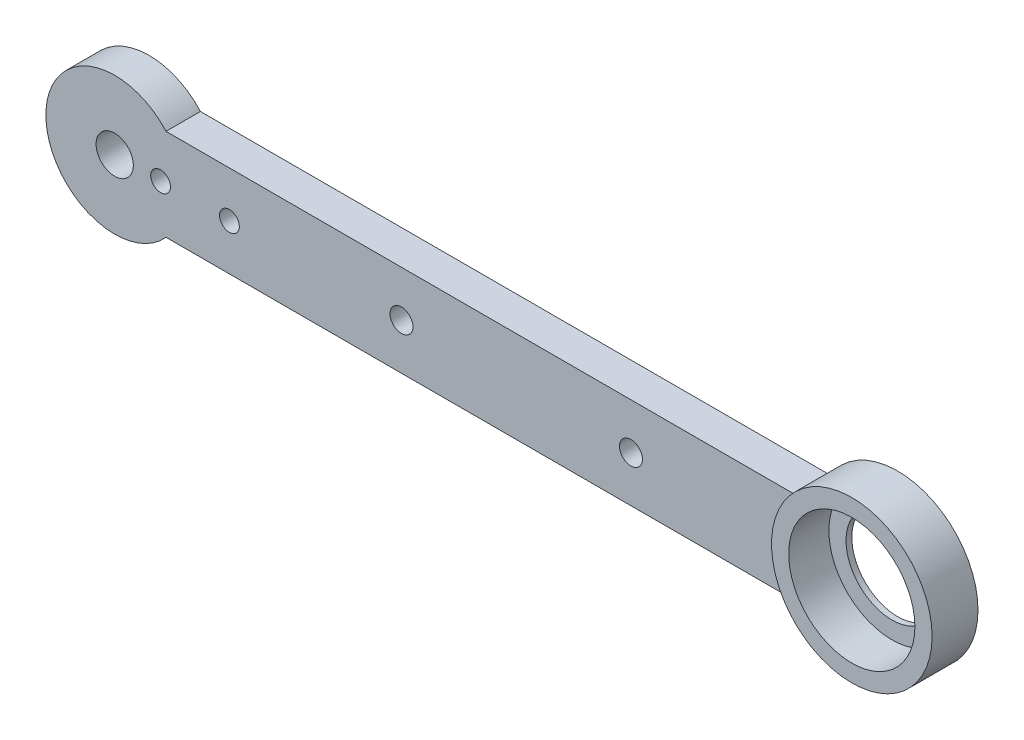
ISO-10303-21;
HEADER;
FILE_DESCRIPTION(('STEP AP214'),'2;1');
FILE_NAME('part.step','',(''),(''),'','','');
FILE_SCHEMA(('AUTOMOTIVE_DESIGN { 1 0 10303 214 1 1 1 1 }'));
ENDSEC;
DATA;
#1=APPLICATION_CONTEXT('core data for automotive mechanical design processes');
#2=APPLICATION_PROTOCOL_DEFINITION('international standard','automotive_design',2000,#1);
#3=PRODUCT_CONTEXT('',#1,'mechanical');
#4=PRODUCT('Part','Part','',(#3));
#5=PRODUCT_RELATED_PRODUCT_CATEGORY('part','',(#4));
#6=PRODUCT_DEFINITION_FORMATION('','',#4);
#7=PRODUCT_DEFINITION_CONTEXT('part definition',#1,'design');
#8=PRODUCT_DEFINITION('design','',#6,#7);
#9=PRODUCT_DEFINITION_SHAPE('','',#8);
#10=(LENGTH_UNIT() NAMED_UNIT(*) SI_UNIT(.MILLI.,.METRE.));
#11=(NAMED_UNIT(*) PLANE_ANGLE_UNIT() SI_UNIT($,.RADIAN.));
#12=(NAMED_UNIT(*) SI_UNIT($,.STERADIAN.) SOLID_ANGLE_UNIT());
#13=UNCERTAINTY_MEASURE_WITH_UNIT(LENGTH_MEASURE(1.E-05),#10,'distance_accuracy_value','');
#14=(GEOMETRIC_REPRESENTATION_CONTEXT(3) GLOBAL_UNCERTAINTY_ASSIGNED_CONTEXT((#13)) GLOBAL_UNIT_ASSIGNED_CONTEXT((#10,
#11,#12)) REPRESENTATION_CONTEXT('',''));
#15=CARTESIAN_POINT('',(0.,0.,0.));
#16=DIRECTION('',(0.,0.,1.));
#17=DIRECTION('',(1.,0.,0.));
#18=AXIS2_PLACEMENT_3D('',#15,#16,#17);
#19=CARTESIAN_POINT('',(0.,0.,9.));
#20=DIRECTION('',(0.,0.,1.));
#21=DIRECTION('',(1.,0.,0.));
#22=AXIS2_PLACEMENT_3D('',#19,#20,#21);
#23=PLANE('',#22);
#24=CARTESIAN_POINT('',(50.,0.,9.));
#25=DIRECTION('',(0.,0.,1.));
#26=DIRECTION('',(1.,0.,0.));
#27=AXIS2_PLACEMENT_3D('',#24,#25,#26);
#28=CIRCLE('',#27,2.);
#29=CARTESIAN_POINT('',(52.,0.,9.));
#30=VERTEX_POINT('',#29);
#31=EDGE_CURVE('E250',#30,#30,#28,.T.);
#32=ORIENTED_EDGE('',*,*,#31,.F.);
#33=EDGE_LOOP('',(#32));
#34=FACE_BOUND('',#33,.T.);
#35=CARTESIAN_POINT('',(90.,0.,9.));
#36=DIRECTION('',(0.,0.,1.));
#37=DIRECTION('',(1.,0.,0.));
#38=AXIS2_PLACEMENT_3D('',#35,#36,#37);
#39=CIRCLE('',#38,2.);
#40=CARTESIAN_POINT('',(92.,0.,9.));
#41=VERTEX_POINT('',#40);
#42=EDGE_CURVE('E254',#41,#41,#39,.T.);
#43=ORIENTED_EDGE('',*,*,#42,.F.);
#44=EDGE_LOOP('',(#43));
#45=FACE_BOUND('',#44,.T.);
#46=CARTESIAN_POINT('',(8.,0.,9.));
#47=DIRECTION('',(0.,0.,1.));
#48=DIRECTION('',(1.,0.,0.));
#49=AXIS2_PLACEMENT_3D('',#46,#47,#48);
#50=CIRCLE('',#49,1.725);
#51=CARTESIAN_POINT('',(9.725,0.,9.));
#52=VERTEX_POINT('',#51);
#53=EDGE_CURVE('E114',#52,#52,#50,.F.);
#54=ORIENTED_EDGE('',*,*,#53,.T.);
#55=EDGE_LOOP('',(#54));
#56=FACE_BOUND('',#55,.T.);
#57=CARTESIAN_POINT('',(20.,0.,9.));
#58=DIRECTION('',(0.,0.,1.));
#59=DIRECTION('',(1.,0.,0.));
#60=AXIS2_PLACEMENT_3D('',#57,#58,#59);
#61=CIRCLE('',#60,1.725);
#62=CARTESIAN_POINT('',(21.725,0.,9.));
#63=VERTEX_POINT('',#62);
#64=EDGE_CURVE('E117',#63,#63,#61,.F.);
#65=ORIENTED_EDGE('',*,*,#64,.T.);
#66=EDGE_LOOP('',(#65));
#67=FACE_BOUND('',#66,.T.);
#68=CARTESIAN_POINT('',(0.,0.,9.));
#69=DIRECTION('',(0.,0.,1.));
#70=DIRECTION('',(1.,0.,0.));
#71=AXIS2_PLACEMENT_3D('',#68,#69,#70);
#72=CIRCLE('',#71,3.25);
#73=CARTESIAN_POINT('',(3.25,0.,9.));
#74=VERTEX_POINT('',#73);
#75=EDGE_CURVE('E112',#74,#74,#72,.F.);
#76=ORIENTED_EDGE('',*,*,#75,.T.);
#77=EDGE_LOOP('',(#76));
#78=FACE_BOUND('',#77,.T.);
#79=DIRECTION('',(1.,0.,0.));
#80=VECTOR('',#79,1.);
#81=CARTESIAN_POINT('',(0.,-8.,9.));
#82=LINE('',#81,#80);
#83=CARTESIAN_POINT('',(8.94427190999916,-8.,9.));
#84=VERTEX_POINT('',#83);
#85=CARTESIAN_POINT('',(118.510874706924,-8.,9.));
#86=VERTEX_POINT('',#85);
#87=EDGE_CURVE('E110',#84,#86,#82,.T.);
#88=ORIENTED_EDGE('',*,*,#87,.T.);
#89=CARTESIAN_POINT('',(130.,0.,9.));
#90=DIRECTION('',(0.,0.,1.));
#91=DIRECTION('',(1.,0.,0.));
#92=AXIS2_PLACEMENT_3D('',#89,#90,#91);
#93=CIRCLE('',#92,14.);
#94=CARTESIAN_POINT('',(118.510874706924,8.,9.));
#95=VERTEX_POINT('',#94);
#96=EDGE_CURVE('E92',#86,#95,#93,.F.);
#97=ORIENTED_EDGE('',*,*,#96,.T.);
#98=DIRECTION('',(-1.,0.,0.));
#99=VECTOR('',#98,1.);
#100=CARTESIAN_POINT('',(130.,8.,9.));
#101=LINE('',#100,#99);
#102=CARTESIAN_POINT('',(8.94427190999916,8.,9.));
#103=VERTEX_POINT('',#102);
#104=EDGE_CURVE('E48',#95,#103,#101,.T.);
#105=ORIENTED_EDGE('',*,*,#104,.T.);
#106=CARTESIAN_POINT('',(0.,0.,9.));
#107=DIRECTION('',(0.,0.,1.));
#108=DIRECTION('',(1.,0.,0.));
#109=AXIS2_PLACEMENT_3D('',#106,#107,#108);
#110=CIRCLE('',#109,12.);
#111=EDGE_CURVE('E98',#103,#84,#110,.T.);
#112=ORIENTED_EDGE('',*,*,#111,.T.);
#113=EDGE_LOOP('',(#88,#97,#105,#112));
#114=FACE_BOUND('',#113,.T.);
#115=ADVANCED_FACE('F39',(#34,#45,#56,#67,#78,#114),#23,.T.);
#116=CARTESIAN_POINT('',(0.,0.,3.));
#117=DIRECTION('',(0.,0.,1.));
#118=DIRECTION('',(1.,0.,0.));
#119=AXIS2_PLACEMENT_3D('',#116,#117,#118);
#120=PLANE('',#119);
#121=CARTESIAN_POINT('',(20.,0.,3.));
#122=DIRECTION('',(0.,0.,1.));
#123=DIRECTION('',(1.,0.,0.));
#124=AXIS2_PLACEMENT_3D('',#121,#122,#123);
#125=CIRCLE('',#124,2.9);
#126=CARTESIAN_POINT('',(22.9,0.,3.));
#127=VERTEX_POINT('',#126);
#128=EDGE_CURVE('E126',#127,#127,#125,.T.);
#129=ORIENTED_EDGE('',*,*,#128,.T.);
#130=EDGE_LOOP('',(#129));
#131=FACE_BOUND('',#130,.T.);
#132=CARTESIAN_POINT('',(8.,0.,3.));
#133=DIRECTION('',(0.,0.,1.));
#134=DIRECTION('',(1.,0.,0.));
#135=AXIS2_PLACEMENT_3D('',#132,#133,#134);
#136=CIRCLE('',#135,2.9);
#137=CARTESIAN_POINT('',(10.9,0.,3.));
#138=VERTEX_POINT('',#137);
#139=EDGE_CURVE('E125',#138,#138,#136,.T.);
#140=ORIENTED_EDGE('',*,*,#139,.T.);
#141=EDGE_LOOP('',(#140));
#142=FACE_BOUND('',#141,.T.);
#143=CARTESIAN_POINT('',(0.,0.,3.));
#144=DIRECTION('',(0.,0.,1.));
#145=DIRECTION('',(1.,0.,0.));
#146=AXIS2_PLACEMENT_3D('',#143,#144,#145);
#147=CIRCLE('',#146,3.25);
#148=CARTESIAN_POINT('',(3.25,0.,3.));
#149=VERTEX_POINT('',#148);
#150=EDGE_CURVE('E111',#149,#149,#147,.F.);
#151=ORIENTED_EDGE('',*,*,#150,.F.);
#152=EDGE_LOOP('',(#151));
#153=FACE_BOUND('',#152,.T.);
#154=CARTESIAN_POINT('',(130.,0.,3.));
#155=DIRECTION('',(0.,0.,1.));
#156=DIRECTION('',(1.,0.,0.));
#157=AXIS2_PLACEMENT_3D('',#154,#155,#156);
#158=CIRCLE('',#157,14.);
#159=CARTESIAN_POINT('',(118.510874706924,-8.00000000000001,3.));
#160=VERTEX_POINT('',#159);
#161=CARTESIAN_POINT('',(118.510874706924,8.,3.));
#162=VERTEX_POINT('',#161);
#163=EDGE_CURVE('E11',#160,#162,#158,.F.);
#164=ORIENTED_EDGE('',*,*,#163,.F.);
#165=DIRECTION('',(1.,0.,0.));
#166=VECTOR('',#165,1.);
#167=CARTESIAN_POINT('',(0.,-8.,3.));
#168=LINE('',#167,#166);
#169=CARTESIAN_POINT('',(8.94427190999916,-8.,3.));
#170=VERTEX_POINT('',#169);
#171=EDGE_CURVE('E84',#170,#160,#168,.T.);
#172=ORIENTED_EDGE('',*,*,#171,.F.);
#173=CARTESIAN_POINT('',(0.,0.,3.));
#174=DIRECTION('',(0.,0.,1.));
#175=DIRECTION('',(1.,0.,0.));
#176=AXIS2_PLACEMENT_3D('',#173,#174,#175);
#177=CIRCLE('',#176,12.);
#178=CARTESIAN_POINT('',(8.94427190999916,8.,3.));
#179=VERTEX_POINT('',#178);
#180=EDGE_CURVE('E94',#179,#170,#177,.T.);
#181=ORIENTED_EDGE('',*,*,#180,.F.);
#182=DIRECTION('',(-1.,0.,0.));
#183=VECTOR('',#182,1.);
#184=CARTESIAN_POINT('',(130.,8.,3.));
#185=LINE('',#184,#183);
#186=EDGE_CURVE('E81',#162,#179,#185,.T.);
#187=ORIENTED_EDGE('',*,*,#186,.F.);
#188=EDGE_LOOP('',(#164,#172,#181,#187));
#189=FACE_BOUND('',#188,.T.);
#190=ADVANCED_FACE('F78',(#131,#142,#153,#189),#120,.F.);
#191=CARTESIAN_POINT('',(0.,-8.,9.));
#192=DIRECTION('',(0.,1.,0.));
#193=DIRECTION('',(0.,0.,1.));
#194=AXIS2_PLACEMENT_3D('',#191,#192,#193);
#195=PLANE('',#194);
#196=DIRECTION('',(0.,0.,-1.));
#197=VECTOR('',#196,1.);
#198=CARTESIAN_POINT('',(118.510874706924,-8.,9.));
#199=LINE('',#198,#197);
#200=EDGE_CURVE('E57',#86,#160,#199,.T.);
#201=ORIENTED_EDGE('',*,*,#200,.F.);
#202=ORIENTED_EDGE('',*,*,#87,.F.);
#203=DIRECTION('',(0.,0.,-1.));
#204=VECTOR('',#203,1.);
#205=CARTESIAN_POINT('',(8.94427190999916,-8.,9.));
#206=LINE('',#205,#204);
#207=EDGE_CURVE('E88',#170,#84,#206,.F.);
#208=ORIENTED_EDGE('',*,*,#207,.F.);
#209=ORIENTED_EDGE('',*,*,#171,.T.);
#210=EDGE_LOOP('',(#201,#202,#208,#209));
#211=FACE_BOUND('',#210,.T.);
#212=ADVANCED_FACE('F41',(#211),#195,.F.);
#213=CARTESIAN_POINT('',(130.,8.,9.));
#214=DIRECTION('',(0.,-1.,0.));
#215=DIRECTION('',(0.,0.,-1.));
#216=AXIS2_PLACEMENT_3D('',#213,#214,#215);
#217=PLANE('',#216);
#218=DIRECTION('',(0.,0.,-1.));
#219=VECTOR('',#218,1.);
#220=CARTESIAN_POINT('',(118.510874706924,8.,9.));
#221=LINE('',#220,#219);
#222=EDGE_CURVE('E93',#162,#95,#221,.F.);
#223=ORIENTED_EDGE('',*,*,#222,.F.);
#224=ORIENTED_EDGE('',*,*,#186,.T.);
#225=DIRECTION('',(0.,0.,-1.));
#226=VECTOR('',#225,1.);
#227=CARTESIAN_POINT('',(8.94427190999916,8.,9.));
#228=LINE('',#227,#226);
#229=EDGE_CURVE('E105',#103,#179,#228,.T.);
#230=ORIENTED_EDGE('',*,*,#229,.F.);
#231=ORIENTED_EDGE('',*,*,#104,.F.);
#232=EDGE_LOOP('',(#223,#224,#230,#231));
#233=FACE_BOUND('',#232,.T.);
#234=ADVANCED_FACE('F160',(#233),#217,.F.);
#235=CARTESIAN_POINT('',(0.,0.,9.));
#236=DIRECTION('',(0.,0.,-1.));
#237=DIRECTION('',(-1.,0.,0.));
#238=AXIS2_PLACEMENT_3D('',#235,#236,#237);
#239=CYLINDRICAL_SURFACE('',#238,12.);
#240=ORIENTED_EDGE('',*,*,#180,.T.);
#241=ORIENTED_EDGE('',*,*,#207,.T.);
#242=ORIENTED_EDGE('',*,*,#111,.F.);
#243=ORIENTED_EDGE('',*,*,#229,.T.);
#244=EDGE_LOOP('',(#240,#241,#242,#243));
#245=FACE_BOUND('',#244,.T.);
#246=ADVANCED_FACE('F159',(#245),#239,.T.);
#247=CARTESIAN_POINT('',(130.,0.,9.));
#248=DIRECTION('',(0.,0.,-1.));
#249=DIRECTION('',(-1.,0.,0.));
#250=AXIS2_PLACEMENT_3D('',#247,#248,#249);
#251=CYLINDRICAL_SURFACE('',#250,14.);
#252=ORIENTED_EDGE('',*,*,#222,.T.);
#253=ORIENTED_EDGE('',*,*,#96,.F.);
#254=ORIENTED_EDGE('',*,*,#200,.T.);
#255=ORIENTED_EDGE('',*,*,#163,.T.);
#256=EDGE_LOOP('',(#252,#253,#254,#255));
#257=FACE_BOUND('',#256,.T.);
#258=CARTESIAN_POINT('',(130.,0.,2.5));
#259=DIRECTION('',(0.,0.,1.));
#260=DIRECTION('',(1.,0.,0.));
#261=AXIS2_PLACEMENT_3D('',#258,#259,#260);
#262=CIRCLE('',#261,14.);
#263=CARTESIAN_POINT('',(144.,0.,2.5));
#264=VERTEX_POINT('',#263);
#265=EDGE_CURVE('E150',#264,#264,#262,.T.);
#266=ORIENTED_EDGE('',*,*,#265,.T.);
#267=EDGE_LOOP('',(#266));
#268=FACE_BOUND('',#267,.T.);
#269=CARTESIAN_POINT('',(130.,0.,10.5));
#270=DIRECTION('',(0.,0.,1.));
#271=DIRECTION('',(1.,0.,0.));
#272=AXIS2_PLACEMENT_3D('',#269,#270,#271);
#273=CIRCLE('',#272,14.);
#274=CARTESIAN_POINT('',(144.,0.,10.5));
#275=VERTEX_POINT('',#274);
#276=EDGE_CURVE('E146',#275,#275,#273,.T.);
#277=ORIENTED_EDGE('',*,*,#276,.F.);
#278=EDGE_LOOP('',(#277));
#279=FACE_BOUND('',#278,.T.);
#280=ADVANCED_FACE('F87',(#257,#268,#279),#251,.T.);
#281=CARTESIAN_POINT('',(130.,0.,2.5));
#282=DIRECTION('',(0.,0.,1.));
#283=DIRECTION('',(1.,0.,0.));
#284=AXIS2_PLACEMENT_3D('',#281,#282,#283);
#285=PLANE('',#284);
#286=CARTESIAN_POINT('',(130.,0.,2.5));
#287=DIRECTION('',(0.,0.,1.));
#288=DIRECTION('',(1.,0.,0.));
#289=AXIS2_PLACEMENT_3D('',#286,#287,#288);
#290=CIRCLE('',#289,8.00000000000001);
#291=CARTESIAN_POINT('',(138.,0.,2.5));
#292=VERTEX_POINT('',#291);
#293=EDGE_CURVE('E260',#292,#292,#290,.F.);
#294=ORIENTED_EDGE('',*,*,#293,.F.);
#295=EDGE_LOOP('',(#294));
#296=FACE_BOUND('',#295,.T.);
#297=ORIENTED_EDGE('',*,*,#265,.F.);
#298=EDGE_LOOP('',(#297));
#299=FACE_BOUND('',#298,.T.);
#300=ADVANCED_FACE('F185',(#296,#299),#285,.F.);
#301=CARTESIAN_POINT('',(130.,0.,10.5));
#302=DIRECTION('',(0.,0.,1.));
#303=DIRECTION('',(1.,0.,0.));
#304=AXIS2_PLACEMENT_3D('',#301,#302,#303);
#305=PLANE('',#304);
#306=CARTESIAN_POINT('',(130.,0.,10.5));
#307=DIRECTION('',(0.,0.,1.));
#308=DIRECTION('',(1.,0.,0.));
#309=AXIS2_PLACEMENT_3D('',#306,#307,#308);
#310=CIRCLE('',#309,11.);
#311=CARTESIAN_POINT('',(141.,0.,10.5));
#312=VERTEX_POINT('',#311);
#313=EDGE_CURVE('E132',#312,#312,#310,.T.);
#314=ORIENTED_EDGE('',*,*,#313,.F.);
#315=EDGE_LOOP('',(#314));
#316=FACE_BOUND('',#315,.T.);
#317=ORIENTED_EDGE('',*,*,#276,.T.);
#318=EDGE_LOOP('',(#317));
#319=FACE_BOUND('',#318,.T.);
#320=ADVANCED_FACE('F184',(#316,#319),#305,.T.);
#321=CARTESIAN_POINT('',(0.,0.,2.5));
#322=DIRECTION('',(0.,0.,-1.));
#323=DIRECTION('',(-1.,0.,0.));
#324=AXIS2_PLACEMENT_3D('',#321,#322,#323);
#325=CYLINDRICAL_SURFACE('',#324,3.25);
#326=ORIENTED_EDGE('',*,*,#75,.F.);
#327=EDGE_LOOP('',(#326));
#328=FACE_BOUND('',#327,.T.);
#329=ORIENTED_EDGE('',*,*,#150,.T.);
#330=EDGE_LOOP('',(#329));
#331=FACE_BOUND('',#330,.T.);
#332=ADVANCED_FACE('F186',(#328,#331),#325,.F.);
#333=CARTESIAN_POINT('',(20.,0.,2.5));
#334=DIRECTION('',(0.,0.,-1.));
#335=DIRECTION('',(-1.,0.,0.));
#336=AXIS2_PLACEMENT_3D('',#333,#334,#335);
#337=CYLINDRICAL_SURFACE('',#336,1.725);
#338=CARTESIAN_POINT('',(20.,0.,5.2));
#339=DIRECTION('',(0.,0.,1.));
#340=DIRECTION('',(1.,0.,0.));
#341=AXIS2_PLACEMENT_3D('',#338,#339,#340);
#342=CIRCLE('',#341,1.725);
#343=CARTESIAN_POINT('',(21.725,0.,5.2));
#344=VERTEX_POINT('',#343);
#345=EDGE_CURVE('E119',#344,#344,#342,.T.);
#346=ORIENTED_EDGE('',*,*,#345,.F.);
#347=EDGE_LOOP('',(#346));
#348=FACE_BOUND('',#347,.T.);
#349=ORIENTED_EDGE('',*,*,#64,.F.);
#350=EDGE_LOOP('',(#349));
#351=FACE_BOUND('',#350,.T.);
#352=ADVANCED_FACE('F195',(#348,#351),#337,.F.);
#353=CARTESIAN_POINT('',(8.,0.,2.5));
#354=DIRECTION('',(0.,0.,-1.));
#355=DIRECTION('',(-1.,0.,0.));
#356=AXIS2_PLACEMENT_3D('',#353,#354,#355);
#357=CYLINDRICAL_SURFACE('',#356,1.725);
#358=CARTESIAN_POINT('',(8.,0.,5.2));
#359=DIRECTION('',(0.,0.,1.));
#360=DIRECTION('',(1.,0.,0.));
#361=AXIS2_PLACEMENT_3D('',#358,#359,#360);
#362=CIRCLE('',#361,1.725);
#363=CARTESIAN_POINT('',(9.725,0.,5.2));
#364=VERTEX_POINT('',#363);
#365=EDGE_CURVE('E116',#364,#364,#362,.T.);
#366=ORIENTED_EDGE('',*,*,#365,.F.);
#367=EDGE_LOOP('',(#366));
#368=FACE_BOUND('',#367,.T.);
#369=ORIENTED_EDGE('',*,*,#53,.F.);
#370=EDGE_LOOP('',(#369));
#371=FACE_BOUND('',#370,.T.);
#372=ADVANCED_FACE('F200',(#368,#371),#357,.F.);
#373=CARTESIAN_POINT('',(8.,0.,5.2));
#374=DIRECTION('',(0.,0.,-1.));
#375=DIRECTION('',(-1.,0.,0.));
#376=AXIS2_PLACEMENT_3D('',#373,#374,#375);
#377=CYLINDRICAL_SURFACE('',#376,2.9);
#378=CARTESIAN_POINT('',(8.,0.,5.2));
#379=DIRECTION('',(0.,0.,1.));
#380=DIRECTION('',(1.,0.,0.));
#381=AXIS2_PLACEMENT_3D('',#378,#379,#380);
#382=CIRCLE('',#381,2.9);
#383=CARTESIAN_POINT('',(10.9,0.,5.2));
#384=VERTEX_POINT('',#383);
#385=EDGE_CURVE('E118',#384,#384,#382,.T.);
#386=ORIENTED_EDGE('',*,*,#385,.T.);
#387=EDGE_LOOP('',(#386));
#388=FACE_BOUND('',#387,.T.);
#389=ORIENTED_EDGE('',*,*,#139,.F.);
#390=EDGE_LOOP('',(#389));
#391=FACE_BOUND('',#390,.T.);
#392=ADVANCED_FACE('F201',(#388,#391),#377,.F.);
#393=CARTESIAN_POINT('',(8.,0.,5.2));
#394=DIRECTION('',(0.,0.,1.));
#395=DIRECTION('',(1.,0.,0.));
#396=AXIS2_PLACEMENT_3D('',#393,#394,#395);
#397=PLANE('',#396);
#398=ORIENTED_EDGE('',*,*,#365,.T.);
#399=EDGE_LOOP('',(#398));
#400=FACE_BOUND('',#399,.T.);
#401=ORIENTED_EDGE('',*,*,#385,.F.);
#402=EDGE_LOOP('',(#401));
#403=FACE_BOUND('',#402,.T.);
#404=ADVANCED_FACE('F205',(#400,#403),#397,.F.);
#405=CARTESIAN_POINT('',(20.,0.,5.2));
#406=DIRECTION('',(0.,0.,-1.));
#407=DIRECTION('',(-1.,0.,0.));
#408=AXIS2_PLACEMENT_3D('',#405,#406,#407);
#409=CYLINDRICAL_SURFACE('',#408,2.9);
#410=CARTESIAN_POINT('',(20.,0.,5.2));
#411=DIRECTION('',(0.,0.,1.));
#412=DIRECTION('',(1.,0.,0.));
#413=AXIS2_PLACEMENT_3D('',#410,#411,#412);
#414=CIRCLE('',#413,2.9);
#415=CARTESIAN_POINT('',(22.9,0.,5.2));
#416=VERTEX_POINT('',#415);
#417=EDGE_CURVE('E124',#416,#416,#414,.T.);
#418=ORIENTED_EDGE('',*,*,#417,.T.);
#419=EDGE_LOOP('',(#418));
#420=FACE_BOUND('',#419,.T.);
#421=ORIENTED_EDGE('',*,*,#128,.F.);
#422=EDGE_LOOP('',(#421));
#423=FACE_BOUND('',#422,.T.);
#424=ADVANCED_FACE('F209',(#420,#423),#409,.F.);
#425=CARTESIAN_POINT('',(20.,0.,5.2));
#426=DIRECTION('',(0.,0.,1.));
#427=DIRECTION('',(1.,0.,0.));
#428=AXIS2_PLACEMENT_3D('',#425,#426,#427);
#429=PLANE('',#428);
#430=ORIENTED_EDGE('',*,*,#345,.T.);
#431=EDGE_LOOP('',(#430));
#432=FACE_BOUND('',#431,.T.);
#433=ORIENTED_EDGE('',*,*,#417,.F.);
#434=EDGE_LOOP('',(#433));
#435=FACE_BOUND('',#434,.T.);
#436=ADVANCED_FACE('F215',(#432,#435),#429,.F.);
#437=CARTESIAN_POINT('',(130.,0.,10.5));
#438=DIRECTION('',(0.,0.,-1.));
#439=DIRECTION('',(-1.,0.,0.));
#440=AXIS2_PLACEMENT_3D('',#437,#438,#439);
#441=CYLINDRICAL_SURFACE('',#440,11.);
#442=ORIENTED_EDGE('',*,*,#313,.T.);
#443=EDGE_LOOP('',(#442));
#444=FACE_BOUND('',#443,.T.);
#445=CARTESIAN_POINT('',(130.,0.,3.5));
#446=DIRECTION('',(0.,0.,1.));
#447=DIRECTION('',(1.,0.,0.));
#448=AXIS2_PLACEMENT_3D('',#445,#446,#447);
#449=CIRCLE('',#448,11.);
#450=CARTESIAN_POINT('',(141.,0.,3.5));
#451=VERTEX_POINT('',#450);
#452=EDGE_CURVE('E137',#451,#451,#449,.T.);
#453=ORIENTED_EDGE('',*,*,#452,.F.);
#454=EDGE_LOOP('',(#453));
#455=FACE_BOUND('',#454,.T.);
#456=ADVANCED_FACE('F218',(#444,#455),#441,.F.);
#457=CARTESIAN_POINT('',(130.,0.,3.5));
#458=DIRECTION('',(0.,0.,1.));
#459=DIRECTION('',(1.,0.,0.));
#460=AXIS2_PLACEMENT_3D('',#457,#458,#459);
#461=PLANE('',#460);
#462=CARTESIAN_POINT('',(130.,0.,3.5));
#463=DIRECTION('',(0.,0.,1.));
#464=DIRECTION('',(1.,0.,0.));
#465=AXIS2_PLACEMENT_3D('',#462,#463,#464);
#466=CIRCLE('',#465,8.00000000000001);
#467=CARTESIAN_POINT('',(138.,0.,3.5));
#468=VERTEX_POINT('',#467);
#469=EDGE_CURVE('E43',#468,#468,#466,.F.);
#470=ORIENTED_EDGE('',*,*,#469,.T.);
#471=EDGE_LOOP('',(#470));
#472=FACE_BOUND('',#471,.T.);
#473=ORIENTED_EDGE('',*,*,#452,.T.);
#474=EDGE_LOOP('',(#473));
#475=FACE_BOUND('',#474,.T.);
#476=ADVANCED_FACE('F217',(#472,#475),#461,.T.);
#477=CARTESIAN_POINT('',(130.,0.,2.5));
#478=DIRECTION('',(0.,0.,-1.));
#479=DIRECTION('',(-1.,0.,0.));
#480=AXIS2_PLACEMENT_3D('',#477,#478,#479);
#481=CYLINDRICAL_SURFACE('',#480,8.00000000000001);
#482=ORIENTED_EDGE('',*,*,#469,.F.);
#483=EDGE_LOOP('',(#482));
#484=FACE_BOUND('',#483,.T.);
#485=ORIENTED_EDGE('',*,*,#293,.T.);
#486=EDGE_LOOP('',(#485));
#487=FACE_BOUND('',#486,.T.);
#488=ADVANCED_FACE('F224',(#484,#487),#481,.F.);
#489=CARTESIAN_POINT('',(90.,0.,9.));
#490=DIRECTION('',(0.,0.,-1.));
#491=DIRECTION('',(-1.,0.,0.));
#492=AXIS2_PLACEMENT_3D('',#489,#490,#491);
#493=CYLINDRICAL_SURFACE('',#492,2.);
#494=ORIENTED_EDGE('',*,*,#42,.T.);
#495=EDGE_LOOP('',(#494));
#496=FACE_BOUND('',#495,.T.);
#497=CARTESIAN_POINT('',(90.,0.,5.));
#498=DIRECTION('',(0.,0.,1.));
#499=DIRECTION('',(1.,0.,0.));
#500=AXIS2_PLACEMENT_3D('',#497,#498,#499);
#501=CIRCLE('',#500,2.);
#502=CARTESIAN_POINT('',(92.,0.,5.));
#503=VERTEX_POINT('',#502);
#504=EDGE_CURVE('E247',#503,#503,#501,.T.);
#505=ORIENTED_EDGE('',*,*,#504,.F.);
#506=EDGE_LOOP('',(#505));
#507=FACE_BOUND('',#506,.T.);
#508=ADVANCED_FACE('F228',(#496,#507),#493,.F.);
#509=CARTESIAN_POINT('',(90.,0.,5.));
#510=DIRECTION('',(0.,0.,1.));
#511=DIRECTION('',(1.,0.,0.));
#512=AXIS2_PLACEMENT_3D('',#509,#510,#511);
#513=PLANE('',#512);
#514=ORIENTED_EDGE('',*,*,#504,.T.);
#515=EDGE_LOOP('',(#514));
#516=FACE_BOUND('',#515,.T.);
#517=ADVANCED_FACE('F226',(#516),#513,.T.);
#518=CARTESIAN_POINT('',(50.,0.,9.));
#519=DIRECTION('',(0.,0.,-1.));
#520=DIRECTION('',(-1.,0.,0.));
#521=AXIS2_PLACEMENT_3D('',#518,#519,#520);
#522=CYLINDRICAL_SURFACE('',#521,2.);
#523=ORIENTED_EDGE('',*,*,#31,.T.);
#524=EDGE_LOOP('',(#523));
#525=FACE_BOUND('',#524,.T.);
#526=CARTESIAN_POINT('',(50.,0.,5.));
#527=DIRECTION('',(0.,0.,1.));
#528=DIRECTION('',(1.,0.,0.));
#529=AXIS2_PLACEMENT_3D('',#526,#527,#528);
#530=CIRCLE('',#529,2.);
#531=CARTESIAN_POINT('',(52.,0.,5.));
#532=VERTEX_POINT('',#531);
#533=EDGE_CURVE('E244',#532,#532,#530,.T.);
#534=ORIENTED_EDGE('',*,*,#533,.F.);
#535=EDGE_LOOP('',(#534));
#536=FACE_BOUND('',#535,.T.);
#537=ADVANCED_FACE('F233',(#525,#536),#522,.F.);
#538=CARTESIAN_POINT('',(50.,0.,5.));
#539=DIRECTION('',(0.,0.,1.));
#540=DIRECTION('',(1.,0.,0.));
#541=AXIS2_PLACEMENT_3D('',#538,#539,#540);
#542=PLANE('',#541);
#543=ORIENTED_EDGE('',*,*,#533,.T.);
#544=EDGE_LOOP('',(#543));
#545=FACE_BOUND('',#544,.T.);
#546=ADVANCED_FACE('F240',(#545),#542,.T.);
#547=CLOSED_SHELL('',(#115,#190,#212,#234,#246,#280,#300,#320,#332,#352,#372,#392,#404,#424,
#436,#456,#476,#488,#508,#517,#537,#546));
#548=MANIFOLD_SOLID_BREP('B2',#547);
#549=ADVANCED_BREP_SHAPE_REPRESENTATION('',(#18,#548),#14);
#550=SHAPE_DEFINITION_REPRESENTATION(#9,#549);
ENDSEC;
END-ISO-10303-21;
